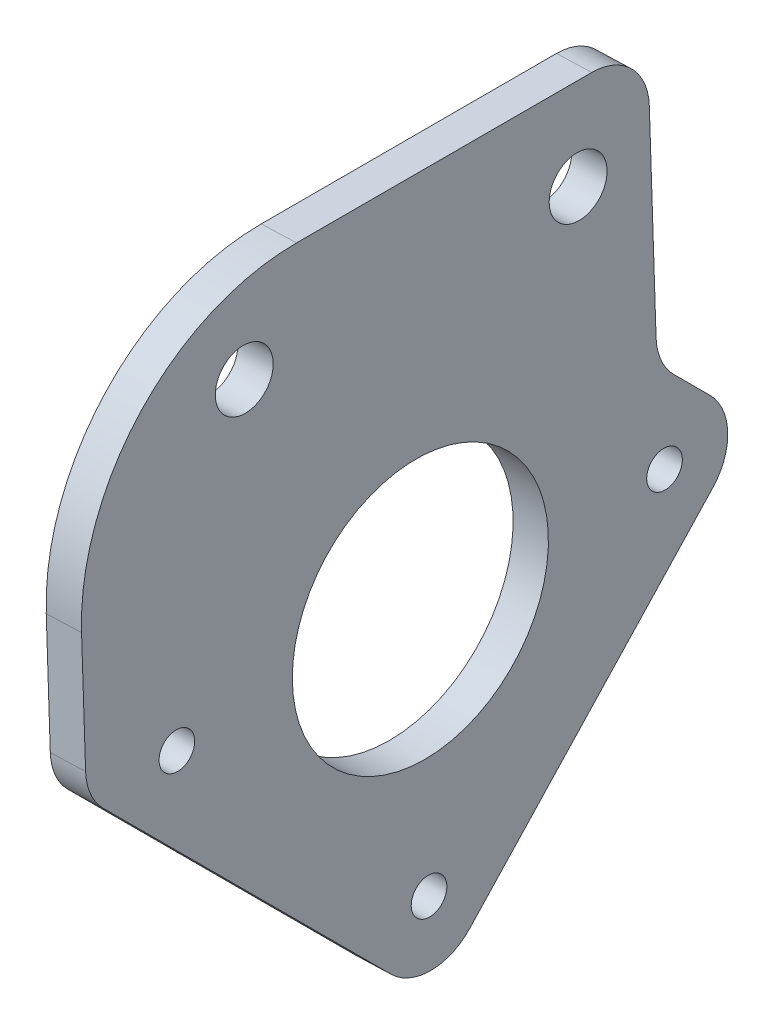
ISO-10303-21;
HEADER;
FILE_DESCRIPTION(('STEP AP214'),'2;1');
FILE_NAME('part.step','',(''),(''),'','','');
FILE_SCHEMA(('AUTOMOTIVE_DESIGN { 1 0 10303 214 1 1 1 1 }'));
ENDSEC;
DATA;
#1=APPLICATION_CONTEXT('core data for automotive mechanical design processes');
#2=APPLICATION_PROTOCOL_DEFINITION('international standard','automotive_design',2000,#1);
#3=PRODUCT_CONTEXT('',#1,'mechanical');
#4=PRODUCT('Part','Part','',(#3));
#5=PRODUCT_RELATED_PRODUCT_CATEGORY('part','',(#4));
#6=PRODUCT_DEFINITION_FORMATION('','',#4);
#7=PRODUCT_DEFINITION_CONTEXT('part definition',#1,'design');
#8=PRODUCT_DEFINITION('design','',#6,#7);
#9=PRODUCT_DEFINITION_SHAPE('','',#8);
#10=(LENGTH_UNIT() NAMED_UNIT(*) SI_UNIT(.MILLI.,.METRE.));
#11=(NAMED_UNIT(*) PLANE_ANGLE_UNIT() SI_UNIT($,.RADIAN.));
#12=(NAMED_UNIT(*) SI_UNIT($,.STERADIAN.) SOLID_ANGLE_UNIT());
#13=UNCERTAINTY_MEASURE_WITH_UNIT(LENGTH_MEASURE(1.E-05),#10,'distance_accuracy_value','');
#14=(GEOMETRIC_REPRESENTATION_CONTEXT(3) GLOBAL_UNCERTAINTY_ASSIGNED_CONTEXT((#13)) GLOBAL_UNIT_ASSIGNED_CONTEXT((#10,
#11,#12)) REPRESENTATION_CONTEXT('',''));
#15=CARTESIAN_POINT('',(0.,0.,0.));
#16=DIRECTION('',(0.,0.,1.));
#17=DIRECTION('',(1.,0.,0.));
#18=AXIS2_PLACEMENT_3D('',#15,#16,#17);
#19=CARTESIAN_POINT('',(160.415866911299,47.665317477209,394.926215189379));
#20=DIRECTION('',(-0.999416070329976,-0.0341689678830016,0.));
#21=DIRECTION('',(0.0341689678830016,-0.999416070329976,0.));
#22=AXIS2_PLACEMENT_3D('',#19,#20,#21);
#23=CYLINDRICAL_SURFACE('',#22,20.);
#24=CARTESIAN_POINT('',(157.242720888001,47.5568310041805,394.926215189379));
#25=DIRECTION('',(-0.999416070329975,-0.0341689678830016,0.));
#26=DIRECTION('',(0.0341689678830016,-0.999416070329975,0.));
#27=AXIS2_PLACEMENT_3D('',#24,#25,#26);
#28=CIRCLE('',#27,20.);
#29=CARTESIAN_POINT('',(157.242720888001,47.5568310041805,414.926215189379));
#30=VERTEX_POINT('',#29);
#31=CARTESIAN_POINT('',(156.559341530341,67.5451524107799,394.926215189379));
#32=VERTEX_POINT('',#31);
#33=EDGE_CURVE('E158',#30,#32,#28,.T.);
#34=ORIENTED_EDGE('',*,*,#33,.F.);
#35=DIRECTION('',(-0.999416070329976,-0.0341689678830016,0.));
#36=VECTOR('',#35,1.);
#37=CARTESIAN_POINT('',(160.415866911299,47.665317477209,414.926215189379));
#38=LINE('',#37,#36);
#39=CARTESIAN_POINT('',(160.415866911299,47.665317477209,414.926215189379));
#40=VERTEX_POINT('',#39);
#41=EDGE_CURVE('E11',#40,#30,#38,.T.);
#42=ORIENTED_EDGE('',*,*,#41,.F.);
#43=CARTESIAN_POINT('',(160.415866911299,47.665317477209,394.926215189379));
#44=DIRECTION('',(-0.999416070329975,-0.0341689678830016,0.));
#45=DIRECTION('',(0.0341689678830016,-0.999416070329975,0.));
#46=AXIS2_PLACEMENT_3D('',#43,#44,#45);
#47=CIRCLE('',#46,20.);
#48=CARTESIAN_POINT('',(159.732487553638,67.6536388838084,394.926215189379));
#49=VERTEX_POINT('',#48);
#50=EDGE_CURVE('E191',#40,#49,#47,.T.);
#51=ORIENTED_EDGE('',*,*,#50,.T.);
#52=DIRECTION('',(-0.999416070329976,-0.0341689678830016,0.));
#53=VECTOR('',#52,1.);
#54=CARTESIAN_POINT('',(159.732487553638,67.6536388838084,394.926215189379));
#55=LINE('',#54,#53);
#56=EDGE_CURVE('E104',#49,#32,#55,.T.);
#57=ORIENTED_EDGE('',*,*,#56,.T.);
#58=EDGE_LOOP('',(#34,#42,#51,#57));
#59=FACE_BOUND('',#58,.T.);
#60=ADVANCED_FACE('F36',(#59),#23,.T.);
#61=CARTESIAN_POINT('',(160.779025283161,37.0432139897202,414.926215189379));
#62=DIRECTION('',(0.,0.,1.));
#63=DIRECTION('',(0.,-1.,0.));
#64=AXIS2_PLACEMENT_3D('',#61,#62,#63);
#65=PLANE('',#64);
#66=DIRECTION('',(-0.0341689678830024,0.999416070329975,0.));
#67=VECTOR('',#66,1.);
#68=CARTESIAN_POINT('',(157.605879259863,36.9347275166917,414.926215189379));
#69=LINE('',#68,#67);
#70=CARTESIAN_POINT('',(157.605879259863,36.9347275166917,414.926215189379));
#71=VERTEX_POINT('',#70);
#72=EDGE_CURVE('E189',#71,#30,#69,.T.);
#73=ORIENTED_EDGE('',*,*,#72,.F.);
#74=DIRECTION('',(-0.999416070329976,-0.0341689678830016,0.));
#75=VECTOR('',#74,1.);
#76=CARTESIAN_POINT('',(160.779025283161,37.0432139897202,414.926215189379));
#77=LINE('',#76,#75);
#78=CARTESIAN_POINT('',(160.779025283161,37.0432139897202,414.926215189379));
#79=VERTEX_POINT('',#78);
#80=EDGE_CURVE('E45',#79,#71,#77,.T.);
#81=ORIENTED_EDGE('',*,*,#80,.F.);
#82=DIRECTION('',(-0.0341689678830024,0.999416070329975,0.));
#83=VECTOR('',#82,1.);
#84=CARTESIAN_POINT('',(160.779025283161,37.0432139897202,414.926215189379));
#85=LINE('',#84,#83);
#86=EDGE_CURVE('E148',#79,#40,#85,.T.);
#87=ORIENTED_EDGE('',*,*,#86,.T.);
#88=ORIENTED_EDGE('',*,*,#41,.T.);
#89=EDGE_LOOP('',(#73,#81,#87,#88));
#90=FACE_BOUND('',#89,.T.);
#91=ADVANCED_FACE('F274',(#90),#65,.T.);
#92=CARTESIAN_POINT('',(160.779025283161,37.0432139897202,409.926215189379));
#93=DIRECTION('',(-0.999416070329976,-0.0341689678830016,0.));
#94=DIRECTION('',(0.0341689678830016,-0.999416070329976,0.));
#95=AXIS2_PLACEMENT_3D('',#92,#93,#94);
#96=CYLINDRICAL_SURFACE('',#95,4.99999999999972);
#97=CARTESIAN_POINT('',(157.605879259863,36.9347275166916,409.926215189379));
#98=DIRECTION('',(-0.999416070329975,-0.0341689678830016,0.));
#99=DIRECTION('',(0.0341689678830016,-0.999416070329975,0.));
#100=AXIS2_PLACEMENT_3D('',#97,#98,#99);
#101=CIRCLE('',#100,4.99999999999972);
#102=CARTESIAN_POINT('',(157.726684804345,33.4012581139062,413.461749095311));
#103=VERTEX_POINT('',#102);
#104=EDGE_CURVE('E135',#103,#71,#101,.T.);
#105=ORIENTED_EDGE('',*,*,#104,.F.);
#106=DIRECTION('',(-0.999416070329976,-0.0341689678830016,0.));
#107=VECTOR('',#106,1.);
#108=CARTESIAN_POINT('',(160.899830827642,33.5097445869348,413.461749095311));
#109=LINE('',#108,#107);
#110=CARTESIAN_POINT('',(160.899830827642,33.5097445869348,413.461749095311));
#111=VERTEX_POINT('',#110);
#112=EDGE_CURVE('E130',#111,#103,#109,.T.);
#113=ORIENTED_EDGE('',*,*,#112,.F.);
#114=CARTESIAN_POINT('',(160.779025283161,37.0432139897202,409.926215189379));
#115=DIRECTION('',(-0.999416070329975,-0.0341689678830016,0.));
#116=DIRECTION('',(0.0341689678830016,-0.999416070329975,0.));
#117=AXIS2_PLACEMENT_3D('',#114,#115,#116);
#118=CIRCLE('',#117,4.99999999999972);
#119=EDGE_CURVE('E133',#111,#79,#118,.T.);
#120=ORIENTED_EDGE('',*,*,#119,.T.);
#121=ORIENTED_EDGE('',*,*,#80,.T.);
#122=EDGE_LOOP('',(#105,#113,#120,#121));
#123=FACE_BOUND('',#122,.T.);
#124=ADVANCED_FACE('F132',(#123),#96,.T.);
#125=CARTESIAN_POINT('',(161.753717376477,8.53421878038838,388.471630817245));
#126=DIRECTION('',(0.0241611088962145,-0.706693880557129,0.707106781186556));
#127=DIRECTION('',(0.,-0.707313261630569,-0.706900240431085));
#128=AXIS2_PLACEMENT_3D('',#125,#126,#127);
#129=PLANE('',#128);
#130=DIRECTION('',(-0.0241611088962171,0.706693880557145,0.70710678118654));
#131=VECTOR('',#130,1.);
#132=CARTESIAN_POINT('',(158.58057135318,8.42573230735986,388.471630817245));
#133=LINE('',#132,#131);
#134=CARTESIAN_POINT('',(158.58057135318,8.42573230735964,388.471630817246));
#135=VERTEX_POINT('',#134);
#136=EDGE_CURVE('E186',#135,#103,#133,.T.);
#137=ORIENTED_EDGE('',*,*,#136,.F.);
#138=DIRECTION('',(-0.999416070329976,-0.0341689678830016,0.));
#139=VECTOR('',#138,1.);
#140=CARTESIAN_POINT('',(161.753717376477,8.53421878038816,388.471630817246));
#141=LINE('',#140,#139);
#142=CARTESIAN_POINT('',(161.753717376477,8.53421878038816,388.471630817246));
#143=VERTEX_POINT('',#142);
#144=EDGE_CURVE('E140',#143,#135,#141,.T.);
#145=ORIENTED_EDGE('',*,*,#144,.F.);
#146=DIRECTION('',(-0.0241611088962171,0.706693880557145,0.70710678118654));
#147=VECTOR('',#146,1.);
#148=CARTESIAN_POINT('',(161.753717376477,8.53421878038838,388.471630817245));
#149=LINE('',#148,#147);
#150=EDGE_CURVE('E146',#143,#111,#149,.T.);
#151=ORIENTED_EDGE('',*,*,#150,.T.);
#152=ORIENTED_EDGE('',*,*,#112,.T.);
#153=EDGE_LOOP('',(#137,#145,#151,#152));
#154=FACE_BOUND('',#153,.T.);
#155=ADVANCED_FACE('F150',(#154),#129,.T.);
#156=CARTESIAN_POINT('',(161.632911831996,12.067688183174,384.936096911313));
#157=DIRECTION('',(-0.999416070329976,-0.0341689678830016,0.));
#158=DIRECTION('',(0.0341689678830016,-0.999416070329976,0.));
#159=AXIS2_PLACEMENT_3D('',#156,#157,#158);
#160=CYLINDRICAL_SURFACE('',#159,5.00000000000003);
#161=CARTESIAN_POINT('',(158.459765808699,11.9592017101455,384.936096911313));
#162=DIRECTION('',(-0.999416070329975,-0.0341689678830016,0.));
#163=DIRECTION('',(0.0341689678830016,-0.999416070329975,0.));
#164=AXIS2_PLACEMENT_3D('',#161,#162,#163);
#165=CIRCLE('',#164,5.00000000000003);
#166=CARTESIAN_POINT('',(158.58057135318,8.42573230735959,381.40056300538));
#167=VERTEX_POINT('',#166);
#168=EDGE_CURVE('E183',#167,#135,#165,.T.);
#169=ORIENTED_EDGE('',*,*,#168,.F.);
#170=DIRECTION('',(-0.999416070329976,-0.0341689678830016,0.));
#171=VECTOR('',#170,1.);
#172=CARTESIAN_POINT('',(161.753717376477,8.53421878038811,381.40056300538));
#173=LINE('',#172,#171);
#174=CARTESIAN_POINT('',(161.753717376477,8.53421878038811,381.40056300538));
#175=VERTEX_POINT('',#174);
#176=EDGE_CURVE('E195',#175,#167,#173,.T.);
#177=ORIENTED_EDGE('',*,*,#176,.F.);
#178=CARTESIAN_POINT('',(161.632911831996,12.067688183174,384.936096911313));
#179=DIRECTION('',(-0.999416070329975,-0.0341689678830016,0.));
#180=DIRECTION('',(0.0341689678830016,-0.999416070329975,0.));
#181=AXIS2_PLACEMENT_3D('',#178,#179,#180);
#182=CIRCLE('',#181,5.00000000000003);
#183=EDGE_CURVE('E151',#175,#143,#182,.T.);
#184=ORIENTED_EDGE('',*,*,#183,.T.);
#185=ORIENTED_EDGE('',*,*,#144,.T.);
#186=EDGE_LOOP('',(#169,#177,#184,#185));
#187=FACE_BOUND('',#186,.T.);
#188=ADVANCED_FACE('F287',(#187),#160,.T.);
#189=CARTESIAN_POINT('',(160.980561891799,31.1484229582166,358.77314600741));
#190=DIRECTION('',(0.0241611088962168,-0.706693880557139,-0.707106781186546));
#191=DIRECTION('',(0.,0.707313261630559,-0.706900240431095));
#192=AXIS2_PLACEMENT_3D('',#189,#190,#191);
#193=PLANE('',#192);
#194=DIRECTION('',(0.0241611088962147,-0.706693880557135,0.707106781186549));
#195=VECTOR('',#194,1.);
#196=CARTESIAN_POINT('',(157.807415868501,31.0399364851881,358.77314600741));
#197=LINE('',#196,#195);
#198=CARTESIAN_POINT('',(157.807415868501,31.0399364851882,358.77314600741));
#199=VERTEX_POINT('',#198);
#200=EDGE_CURVE('E180',#199,#167,#197,.T.);
#201=ORIENTED_EDGE('',*,*,#200,.F.);
#202=DIRECTION('',(-0.999416070329976,-0.0341689678830016,0.));
#203=VECTOR('',#202,1.);
#204=CARTESIAN_POINT('',(160.980561891799,31.1484229582167,358.77314600741));
#205=LINE('',#204,#203);
#206=CARTESIAN_POINT('',(160.980561891799,31.1484229582167,358.77314600741));
#207=VERTEX_POINT('',#206);
#208=EDGE_CURVE('E197',#207,#199,#205,.T.);
#209=ORIENTED_EDGE('',*,*,#208,.F.);
#210=DIRECTION('',(0.0241611088962147,-0.706693880557135,0.707106781186549));
#211=VECTOR('',#210,1.);
#212=CARTESIAN_POINT('',(160.980561891799,31.1484229582166,358.77314600741));
#213=LINE('',#212,#211);
#214=EDGE_CURVE('E153',#207,#175,#213,.T.);
#215=ORIENTED_EDGE('',*,*,#214,.T.);
#216=ORIENTED_EDGE('',*,*,#176,.T.);
#217=EDGE_LOOP('',(#201,#209,#215,#216));
#218=FACE_BOUND('',#217,.T.);
#219=ADVANCED_FACE('F249',(#218),#193,.T.);
#220=CARTESIAN_POINT('',(160.859756347318,34.6818923610023,362.308679913343));
#221=DIRECTION('',(-0.999416070329976,-0.0341689678830016,0.));
#222=DIRECTION('',(0.0341689678830016,-0.999416070329976,0.));
#223=AXIS2_PLACEMENT_3D('',#220,#221,#222);
#224=CYLINDRICAL_SURFACE('',#223,4.99999999999991);
#225=CARTESIAN_POINT('',(157.68661032402,34.5734058879738,362.308679913343));
#226=DIRECTION('',(-0.999416070329975,-0.0341689678830016,0.));
#227=DIRECTION('',(0.0341689678830016,-0.999416070329975,0.));
#228=AXIS2_PLACEMENT_3D('',#225,#226,#227);
#229=CIRCLE('',#228,4.99999999999991);
#230=CARTESIAN_POINT('',(157.565804779539,38.1068752907592,358.77314600741));
#231=VERTEX_POINT('',#230);
#232=EDGE_CURVE('E177',#231,#199,#229,.T.);
#233=ORIENTED_EDGE('',*,*,#232,.F.);
#234=DIRECTION('',(-0.999416070329976,-0.0341689678830016,0.));
#235=VECTOR('',#234,1.);
#236=CARTESIAN_POINT('',(160.738950802836,38.2153617637877,358.77314600741));
#237=LINE('',#236,#235);
#238=CARTESIAN_POINT('',(160.738950802836,38.2153617637877,358.77314600741));
#239=VERTEX_POINT('',#238);
#240=EDGE_CURVE('E199',#239,#231,#237,.T.);
#241=ORIENTED_EDGE('',*,*,#240,.F.);
#242=CARTESIAN_POINT('',(160.859756347318,34.6818923610023,362.308679913343));
#243=DIRECTION('',(-0.999416070329975,-0.0341689678830016,0.));
#244=DIRECTION('',(0.0341689678830016,-0.999416070329975,0.));
#245=AXIS2_PLACEMENT_3D('',#242,#243,#244);
#246=CIRCLE('',#245,4.99999999999991);
#247=EDGE_CURVE('E243',#239,#207,#246,.T.);
#248=ORIENTED_EDGE('',*,*,#247,.T.);
#249=ORIENTED_EDGE('',*,*,#208,.T.);
#250=EDGE_LOOP('',(#233,#241,#248,#249));
#251=FACE_BOUND('',#250,.T.);
#252=ADVANCED_FACE('F255',(#251),#224,.T.);
#253=CARTESIAN_POINT('',(160.630944758408,41.3744556194703,361.934085629524));
#254=DIRECTION('',(-0.0241611088962154,0.706693880557155,-0.70710678118653));
#255=DIRECTION('',(0.,0.707313261630543,0.706900240431111));
#256=AXIS2_PLACEMENT_3D('',#253,#254,#255);
#257=PLANE('',#256);
#258=DIRECTION('',(0.024161108896216,-0.706693880557119,-0.707106781186566));
#259=VECTOR('',#258,1.);
#260=CARTESIAN_POINT('',(157.457798735111,41.2659691464418,361.934085629524));
#261=LINE('',#260,#259);
#262=CARTESIAN_POINT('',(157.457798735111,41.2659691464418,361.934085629524));
#263=VERTEX_POINT('',#262);
#264=EDGE_CURVE('E174',#263,#231,#261,.T.);
#265=ORIENTED_EDGE('',*,*,#264,.F.);
#266=DIRECTION('',(-0.999416070329976,-0.0341689678830016,0.));
#267=VECTOR('',#266,1.);
#268=CARTESIAN_POINT('',(160.630944758408,41.3744556194703,361.934085629524));
#269=LINE('',#268,#267);
#270=CARTESIAN_POINT('',(160.630944758408,41.3744556194703,361.934085629524));
#271=VERTEX_POINT('',#270);
#272=EDGE_CURVE('E201',#271,#263,#269,.T.);
#273=ORIENTED_EDGE('',*,*,#272,.F.);
#274=DIRECTION('',(0.024161108896216,-0.706693880557119,-0.707106781186566));
#275=VECTOR('',#274,1.);
#276=CARTESIAN_POINT('',(160.630944758408,41.3744556194703,361.934085629524));
#277=LINE('',#276,#275);
#278=EDGE_CURVE('E240',#271,#239,#277,.T.);
#279=ORIENTED_EDGE('',*,*,#278,.T.);
#280=ORIENTED_EDGE('',*,*,#240,.T.);
#281=EDGE_LOOP('',(#265,#273,#279,#280));
#282=FACE_BOUND('',#281,.T.);
#283=ADVANCED_FACE('F258',(#282),#257,.T.);
#284=CARTESIAN_POINT('',(160.510139213927,44.9079250222561,358.398551723591));
#285=DIRECTION('',(-0.999416070329976,-0.0341689678830016,0.));
#286=DIRECTION('',(0.0341689678830016,-0.999416070329976,0.));
#287=AXIS2_PLACEMENT_3D('',#284,#285,#286);
#288=CYLINDRICAL_SURFACE('',#287,4.99999999999996);
#289=CARTESIAN_POINT('',(157.33699319063,44.7994385492276,358.398551723591));
#290=DIRECTION('',(0.999416070329975,0.0341689678830016,0.));
#291=DIRECTION('',(-0.0341689678830016,0.999416070329975,0.));
#292=AXIS2_PLACEMENT_3D('',#289,#290,#291);
#293=CIRCLE('',#292,4.99999999999996);
#294=CARTESIAN_POINT('',(157.33699319063,44.7994385492276,363.398551723591));
#295=VERTEX_POINT('',#294);
#296=EDGE_CURVE('E171',#295,#263,#293,.T.);
#297=ORIENTED_EDGE('',*,*,#296,.F.);
#298=DIRECTION('',(-0.999416070329976,-0.0341689678830016,0.));
#299=VECTOR('',#298,1.);
#300=CARTESIAN_POINT('',(160.510139213927,44.9079250222561,363.398551723591));
#301=LINE('',#300,#299);
#302=CARTESIAN_POINT('',(160.510139213927,44.9079250222561,363.398551723591));
#303=VERTEX_POINT('',#302);
#304=EDGE_CURVE('E203',#303,#295,#301,.T.);
#305=ORIENTED_EDGE('',*,*,#304,.F.);
#306=CARTESIAN_POINT('',(160.510139213927,44.9079250222561,358.398551723591));
#307=DIRECTION('',(0.999416070329975,0.0341689678830016,0.));
#308=DIRECTION('',(-0.0341689678830016,0.999416070329975,0.));
#309=AXIS2_PLACEMENT_3D('',#306,#307,#308);
#310=CIRCLE('',#309,4.99999999999996);
#311=EDGE_CURVE('E237',#303,#271,#310,.T.);
#312=ORIENTED_EDGE('',*,*,#311,.T.);
#313=ORIENTED_EDGE('',*,*,#272,.T.);
#314=EDGE_LOOP('',(#297,#305,#312,#313));
#315=FACE_BOUND('',#314,.T.);
#316=ADVANCED_FACE('F263',(#315),#288,.F.);
#317=CARTESIAN_POINT('',(159.903332393054,62.6565585321586,363.398551723591));
#318=DIRECTION('',(0.,0.,-1.));
#319=DIRECTION('',(-1.,0.,0.));
#320=AXIS2_PLACEMENT_3D('',#317,#318,#319);
#321=PLANE('',#320);
#322=DIRECTION('',(0.0341689678830007,-0.999416070329976,0.));
#323=VECTOR('',#322,1.);
#324=CARTESIAN_POINT('',(156.730186369756,62.5480720591301,363.398551723591));
#325=LINE('',#324,#323);
#326=CARTESIAN_POINT('',(156.730186369756,62.5480720591301,363.398551723591));
#327=VERTEX_POINT('',#326);
#328=EDGE_CURVE('E168',#327,#295,#325,.T.);
#329=ORIENTED_EDGE('',*,*,#328,.F.);
#330=DIRECTION('',(-0.999416070329976,-0.0341689678830016,0.));
#331=VECTOR('',#330,1.);
#332=CARTESIAN_POINT('',(159.903332393054,62.6565585321586,363.398551723591));
#333=LINE('',#332,#331);
#334=CARTESIAN_POINT('',(159.903332393054,62.6565585321586,363.398551723591));
#335=VERTEX_POINT('',#334);
#336=EDGE_CURVE('E205',#335,#327,#333,.T.);
#337=ORIENTED_EDGE('',*,*,#336,.F.);
#338=DIRECTION('',(0.0341689678830007,-0.999416070329976,0.));
#339=VECTOR('',#338,1.);
#340=CARTESIAN_POINT('',(159.903332393054,62.6565585321586,363.398551723591));
#341=LINE('',#340,#339);
#342=EDGE_CURVE('E234',#335,#303,#341,.T.);
#343=ORIENTED_EDGE('',*,*,#342,.T.);
#344=ORIENTED_EDGE('',*,*,#304,.T.);
#345=EDGE_LOOP('',(#329,#337,#343,#344));
#346=FACE_BOUND('',#345,.T.);
#347=ADVANCED_FACE('F266',(#346),#321,.T.);
#348=CARTESIAN_POINT('',(159.903332393054,62.6565585321586,368.398551723591));
#349=DIRECTION('',(-0.999416070329976,-0.0341689678830016,0.));
#350=DIRECTION('',(0.0341689678830016,-0.999416070329976,0.));
#351=AXIS2_PLACEMENT_3D('',#348,#349,#350);
#352=CYLINDRICAL_SURFACE('',#351,4.99999999999999);
#353=CARTESIAN_POINT('',(156.730186369756,62.5480720591301,368.398551723591));
#354=DIRECTION('',(-0.999416070329975,-0.0341689678830016,0.));
#355=DIRECTION('',(0.0341689678830016,-0.999416070329975,0.));
#356=AXIS2_PLACEMENT_3D('',#353,#354,#355);
#357=CIRCLE('',#356,4.99999999999999);
#358=CARTESIAN_POINT('',(156.559341530341,67.54515241078,368.398551723591));
#359=VERTEX_POINT('',#358);
#360=EDGE_CURVE('E165',#359,#327,#357,.T.);
#361=ORIENTED_EDGE('',*,*,#360,.F.);
#362=DIRECTION('',(-0.999416070329976,-0.0341689678830016,0.));
#363=VECTOR('',#362,1.);
#364=CARTESIAN_POINT('',(159.732487553639,67.6536388838085,368.398551723591));
#365=LINE('',#364,#363);
#366=CARTESIAN_POINT('',(159.732487553639,67.6536388838085,368.398551723591));
#367=VERTEX_POINT('',#366);
#368=EDGE_CURVE('E207',#367,#359,#365,.T.);
#369=ORIENTED_EDGE('',*,*,#368,.F.);
#370=CARTESIAN_POINT('',(159.903332393054,62.6565585321586,368.398551723591));
#371=DIRECTION('',(-0.999416070329975,-0.0341689678830016,0.));
#372=DIRECTION('',(0.0341689678830016,-0.999416070329975,0.));
#373=AXIS2_PLACEMENT_3D('',#370,#371,#372);
#374=CIRCLE('',#373,4.99999999999999);
#375=EDGE_CURVE('E231',#367,#335,#374,.T.);
#376=ORIENTED_EDGE('',*,*,#375,.T.);
#377=ORIENTED_EDGE('',*,*,#336,.T.);
#378=EDGE_LOOP('',(#361,#369,#376,#377));
#379=FACE_BOUND('',#378,.T.);
#380=ADVANCED_FACE('F270',(#379),#352,.T.);
#381=CARTESIAN_POINT('',(159.732487553638,67.6536388838084,394.926215189379));
#382=DIRECTION('',(-0.0341689678830016,0.999416070329976,0.));
#383=DIRECTION('',(-0.999416070329976,-0.0341689678830016,0.));
#384=AXIS2_PLACEMENT_3D('',#381,#382,#383);
#385=PLANE('',#384);
#386=DIRECTION('',(0.,0.,-1.));
#387=VECTOR('',#386,1.);
#388=CARTESIAN_POINT('',(156.559341530341,67.5451524107799,394.926215189379));
#389=LINE('',#388,#387);
#390=EDGE_CURVE('E161',#32,#359,#389,.T.);
#391=ORIENTED_EDGE('',*,*,#390,.F.);
#392=ORIENTED_EDGE('',*,*,#56,.F.);
#393=DIRECTION('',(0.,0.,-1.));
#394=VECTOR('',#393,1.);
#395=CARTESIAN_POINT('',(159.732487553638,67.6536388838084,394.926215189379));
#396=LINE('',#395,#394);
#397=EDGE_CURVE('E229',#49,#367,#396,.T.);
#398=ORIENTED_EDGE('',*,*,#397,.T.);
#399=ORIENTED_EDGE('',*,*,#368,.T.);
#400=EDGE_LOOP('',(#391,#392,#398,#399));
#401=FACE_BOUND('',#400,.T.);
#402=ADVANCED_FACE('F271',(#401),#385,.T.);
#403=CARTESIAN_POINT('',(160.415866911299,47.665317477209,394.926215189379));
#404=DIRECTION('',(-0.999416070329975,-0.0341689678830016,0.));
#405=DIRECTION('',(0.0341689678830016,-0.999416070329975,0.));
#406=AXIS2_PLACEMENT_3D('',#403,#404,#405);
#407=PLANE('',#406);
#408=CARTESIAN_POINT('',(160.861039227631,34.6443690970294,406.806051723591));
#409=DIRECTION('',(-0.999416070329975,-0.0341689678830016,0.));
#410=DIRECTION('',(0.0341689678830016,-0.999416070329975,0.));
#411=AXIS2_PLACEMENT_3D('',#408,#409,#410);
#412=CIRCLE('',#411,1.59999999999993);
#413=CARTESIAN_POINT('',(160.915709576244,33.0453033845015,406.806051723591));
#414=VERTEX_POINT('',#413);
#415=EDGE_CURVE('E343',#414,#414,#412,.T.);
#416=ORIENTED_EDGE('',*,*,#415,.T.);
#417=EDGE_LOOP('',(#416));
#418=FACE_BOUND('',#417,.T.);
#419=CARTESIAN_POINT('',(160.861039227631,34.6443690970294,362.99105172359));
#420=DIRECTION('',(-0.999416070329975,-0.0341689678830016,0.));
#421=DIRECTION('',(0.0341689678830016,-0.999416070329975,0.));
#422=AXIS2_PLACEMENT_3D('',#419,#420,#421);
#423=CIRCLE('',#422,1.59999999999993);
#424=CARTESIAN_POINT('',(160.915709576244,33.0453033845015,362.99105172359));
#425=VERTEX_POINT('',#424);
#426=EDGE_CURVE('E347',#425,#425,#423,.T.);
#427=ORIENTED_EDGE('',*,*,#426,.T.);
#428=EDGE_LOOP('',(#427));
#429=FACE_BOUND('',#428,.T.);
#430=CARTESIAN_POINT('',(161.609595891528,12.7496615362755,384.898551723591));
#431=DIRECTION('',(-0.999416070329975,-0.0341689678830016,0.));
#432=DIRECTION('',(0.0341689678830016,-0.999416070329975,0.));
#433=AXIS2_PLACEMENT_3D('',#430,#431,#432);
#434=CIRCLE('',#433,1.59999999999993);
#435=CARTESIAN_POINT('',(161.664266240141,11.1505958237476,384.898551723591));
#436=VERTEX_POINT('',#435);
#437=EDGE_CURVE('E355',#436,#436,#434,.T.);
#438=ORIENTED_EDGE('',*,*,#437,.T.);
#439=EDGE_LOOP('',(#438));
#440=FACE_BOUND('',#439,.T.);
#441=CARTESIAN_POINT('',(160.005839296703,59.6583103211687,369.898551723591));
#442=DIRECTION('',(-0.999416070329975,-0.0341689678830016,0.));
#443=DIRECTION('',(0.0341689678830016,-0.999416070329975,0.));
#444=AXIS2_PLACEMENT_3D('',#441,#442,#443);
#445=CIRCLE('',#444,2.59999999999999);
#446=CARTESIAN_POINT('',(160.094678613198,57.0598285383108,369.898551723591));
#447=VERTEX_POINT('',#446);
#448=EDGE_CURVE('E39',#447,#447,#445,.T.);
#449=ORIENTED_EDGE('',*,*,#448,.T.);
#450=EDGE_LOOP('',(#449));
#451=FACE_BOUND('',#450,.T.);
#452=CARTESIAN_POINT('',(160.005839296703,59.6583103211687,399.898551723591));
#453=DIRECTION('',(-0.999416070329975,-0.0341689678830016,0.));
#454=DIRECTION('',(0.0341689678830016,-0.999416070329975,0.));
#455=AXIS2_PLACEMENT_3D('',#452,#453,#454);
#456=CIRCLE('',#455,2.59999999999999);
#457=CARTESIAN_POINT('',(160.094678613198,57.0598285383108,399.898551723591));
#458=VERTEX_POINT('',#457);
#459=EDGE_CURVE('E209',#458,#458,#456,.T.);
#460=ORIENTED_EDGE('',*,*,#459,.T.);
#461=EDGE_LOOP('',(#460));
#462=FACE_BOUND('',#461,.T.);
#463=CARTESIAN_POINT('',(160.858855446805,34.7082430091375,384.92621518938));
#464=DIRECTION('',(-0.999416070329975,-0.0341689678830016,0.));
#465=DIRECTION('',(0.0341689678830016,-0.999416070329975,0.));
#466=AXIS2_PLACEMENT_3D('',#463,#464,#465);
#467=CIRCLE('',#466,11.5);
#468=CARTESIAN_POINT('',(161.25179857746,23.2149582003427,384.92621518938));
#469=VERTEX_POINT('',#468);
#470=EDGE_CURVE('E162',#469,#469,#467,.T.);
#471=ORIENTED_EDGE('',*,*,#470,.T.);
#472=EDGE_LOOP('',(#471));
#473=FACE_BOUND('',#472,.T.);
#474=ORIENTED_EDGE('',*,*,#50,.F.);
#475=ORIENTED_EDGE('',*,*,#86,.F.);
#476=ORIENTED_EDGE('',*,*,#119,.F.);
#477=ORIENTED_EDGE('',*,*,#150,.F.);
#478=ORIENTED_EDGE('',*,*,#183,.F.);
#479=ORIENTED_EDGE('',*,*,#214,.F.);
#480=ORIENTED_EDGE('',*,*,#247,.F.);
#481=ORIENTED_EDGE('',*,*,#278,.F.);
#482=ORIENTED_EDGE('',*,*,#311,.F.);
#483=ORIENTED_EDGE('',*,*,#342,.F.);
#484=ORIENTED_EDGE('',*,*,#375,.F.);
#485=ORIENTED_EDGE('',*,*,#397,.F.);
#486=EDGE_LOOP('',(#474,#475,#476,#477,#478,#479,#480,#481,#482,#483,#484,#485));
#487=FACE_BOUND('',#486,.T.);
#488=ADVANCED_FACE('F144',(#418,#429,#440,#451,#462,#473,#487),#407,.F.);
#489=CARTESIAN_POINT('',(157.242720888001,47.5568310041805,394.926215189379));
#490=DIRECTION('',(-0.999416070329975,-0.0341689678830016,0.));
#491=DIRECTION('',(0.0341689678830016,-0.999416070329975,0.));
#492=AXIS2_PLACEMENT_3D('',#489,#490,#491);
#493=PLANE('',#492);
#494=CARTESIAN_POINT('',(157.687893204334,34.5358826240009,406.806051723591));
#495=DIRECTION('',(-0.999416070329976,-0.0341689678830016,0.));
#496=DIRECTION('',(0.0341689678830016,-0.999416070329976,0.));
#497=AXIS2_PLACEMENT_3D('',#494,#495,#496);
#498=CIRCLE('',#497,1.59999999999994);
#499=CARTESIAN_POINT('',(157.742563552946,32.936816911473,406.806051723591));
#500=VERTEX_POINT('',#499);
#501=EDGE_CURVE('E341',#500,#500,#498,.T.);
#502=ORIENTED_EDGE('',*,*,#501,.F.);
#503=EDGE_LOOP('',(#502));
#504=FACE_BOUND('',#503,.T.);
#505=CARTESIAN_POINT('',(157.687893204334,34.5358826240009,362.99105172359));
#506=DIRECTION('',(-0.999416070329976,-0.0341689678830016,0.));
#507=DIRECTION('',(0.0341689678830016,-0.999416070329976,0.));
#508=AXIS2_PLACEMENT_3D('',#505,#506,#507);
#509=CIRCLE('',#508,1.59999999999994);
#510=CARTESIAN_POINT('',(157.742563552947,32.936816911473,362.99105172359));
#511=VERTEX_POINT('',#510);
#512=EDGE_CURVE('E344',#511,#511,#509,.T.);
#513=ORIENTED_EDGE('',*,*,#512,.F.);
#514=EDGE_LOOP('',(#513));
#515=FACE_BOUND('',#514,.T.);
#516=CARTESIAN_POINT('',(158.436449868231,12.641175063247,384.898551723591));
#517=DIRECTION('',(-0.999416070329976,-0.0341689678830016,0.));
#518=DIRECTION('',(0.0341689678830016,-0.999416070329976,0.));
#519=AXIS2_PLACEMENT_3D('',#516,#517,#518);
#520=CIRCLE('',#519,1.59999999999994);
#521=CARTESIAN_POINT('',(158.491120216843,11.0421093507191,384.898551723591));
#522=VERTEX_POINT('',#521);
#523=EDGE_CURVE('E353',#522,#522,#520,.T.);
#524=ORIENTED_EDGE('',*,*,#523,.F.);
#525=EDGE_LOOP('',(#524));
#526=FACE_BOUND('',#525,.T.);
#527=CARTESIAN_POINT('',(156.832693273405,59.5498238481402,369.898551723591));
#528=DIRECTION('',(-0.999416070329976,-0.0341689678830016,0.));
#529=DIRECTION('',(0.0341689678830016,-0.999416070329976,0.));
#530=AXIS2_PLACEMENT_3D('',#527,#528,#529);
#531=CIRCLE('',#530,2.59999999999999);
#532=CARTESIAN_POINT('',(156.921532589901,56.9513420652822,369.898551723591));
#533=VERTEX_POINT('',#532);
#534=EDGE_CURVE('E222',#533,#533,#531,.T.);
#535=ORIENTED_EDGE('',*,*,#534,.F.);
#536=EDGE_LOOP('',(#535));
#537=FACE_BOUND('',#536,.T.);
#538=CARTESIAN_POINT('',(156.832693273405,59.5498238481402,399.898551723591));
#539=DIRECTION('',(-0.999416070329976,-0.0341689678830016,0.));
#540=DIRECTION('',(0.0341689678830016,-0.999416070329976,0.));
#541=AXIS2_PLACEMENT_3D('',#538,#539,#540);
#542=CIRCLE('',#541,2.59999999999999);
#543=CARTESIAN_POINT('',(156.921532589901,56.9513420652822,399.898551723591));
#544=VERTEX_POINT('',#543);
#545=EDGE_CURVE('E212',#544,#544,#542,.T.);
#546=ORIENTED_EDGE('',*,*,#545,.F.);
#547=EDGE_LOOP('',(#546));
#548=FACE_BOUND('',#547,.T.);
#549=CARTESIAN_POINT('',(157.685709423508,34.5997565361089,384.92621518938));
#550=DIRECTION('',(-0.999416070329976,-0.0341689678830016,0.));
#551=DIRECTION('',(0.0341689678830016,-0.999416070329976,0.));
#552=AXIS2_PLACEMENT_3D('',#549,#550,#551);
#553=CIRCLE('',#552,11.5);
#554=CARTESIAN_POINT('',(158.078652554162,23.1064717273142,384.92621518938));
#555=VERTEX_POINT('',#554);
#556=EDGE_CURVE('E211',#555,#555,#553,.T.);
#557=ORIENTED_EDGE('',*,*,#556,.F.);
#558=EDGE_LOOP('',(#557));
#559=FACE_BOUND('',#558,.T.);
#560=ORIENTED_EDGE('',*,*,#33,.T.);
#561=ORIENTED_EDGE('',*,*,#390,.T.);
#562=ORIENTED_EDGE('',*,*,#360,.T.);
#563=ORIENTED_EDGE('',*,*,#328,.T.);
#564=ORIENTED_EDGE('',*,*,#296,.T.);
#565=ORIENTED_EDGE('',*,*,#264,.T.);
#566=ORIENTED_EDGE('',*,*,#232,.T.);
#567=ORIENTED_EDGE('',*,*,#200,.T.);
#568=ORIENTED_EDGE('',*,*,#168,.T.);
#569=ORIENTED_EDGE('',*,*,#136,.T.);
#570=ORIENTED_EDGE('',*,*,#104,.T.);
#571=ORIENTED_EDGE('',*,*,#72,.T.);
#572=EDGE_LOOP('',(#560,#561,#562,#563,#564,#565,#566,#567,#568,#569,#570,#571));
#573=FACE_BOUND('',#572,.T.);
#574=ADVANCED_FACE('F273',(#504,#515,#526,#537,#548,#559,#573),#493,.T.);
#575=CARTESIAN_POINT('',(157.685709423508,34.5997565361089,384.92621518938));
#576=DIRECTION('',(-0.999416070329976,-0.0341689678830016,0.));
#577=DIRECTION('',(0.0341689678830016,-0.999416070329976,0.));
#578=AXIS2_PLACEMENT_3D('',#575,#576,#577);
#579=CYLINDRICAL_SURFACE('',#578,11.5);
#580=ORIENTED_EDGE('',*,*,#556,.T.);
#581=EDGE_LOOP('',(#580));
#582=FACE_BOUND('',#581,.T.);
#583=ORIENTED_EDGE('',*,*,#470,.F.);
#584=EDGE_LOOP('',(#583));
#585=FACE_BOUND('',#584,.T.);
#586=ADVANCED_FACE('F310',(#582,#585),#579,.F.);
#587=CARTESIAN_POINT('',(156.832693273405,59.5498238481402,399.898551723591));
#588=DIRECTION('',(-0.999416070329976,-0.0341689678830016,0.));
#589=DIRECTION('',(0.0341689678830016,-0.999416070329976,0.));
#590=AXIS2_PLACEMENT_3D('',#587,#588,#589);
#591=CYLINDRICAL_SURFACE('',#590,2.59999999999999);
#592=ORIENTED_EDGE('',*,*,#545,.T.);
#593=EDGE_LOOP('',(#592));
#594=FACE_BOUND('',#593,.T.);
#595=ORIENTED_EDGE('',*,*,#459,.F.);
#596=EDGE_LOOP('',(#595));
#597=FACE_BOUND('',#596,.T.);
#598=ADVANCED_FACE('F317',(#594,#597),#591,.F.);
#599=CARTESIAN_POINT('',(156.832693273405,59.5498238481402,369.898551723591));
#600=DIRECTION('',(-0.999416070329976,-0.0341689678830016,0.));
#601=DIRECTION('',(0.0341689678830016,-0.999416070329976,0.));
#602=AXIS2_PLACEMENT_3D('',#599,#600,#601);
#603=CYLINDRICAL_SURFACE('',#602,2.59999999999999);
#604=ORIENTED_EDGE('',*,*,#534,.T.);
#605=EDGE_LOOP('',(#604));
#606=FACE_BOUND('',#605,.T.);
#607=ORIENTED_EDGE('',*,*,#448,.F.);
#608=EDGE_LOOP('',(#607));
#609=FACE_BOUND('',#608,.T.);
#610=ADVANCED_FACE('F321',(#606,#609),#603,.F.);
#611=CARTESIAN_POINT('',(158.436449868231,12.641175063247,384.898551723591));
#612=DIRECTION('',(-0.999416070329976,-0.0341689678830016,0.));
#613=DIRECTION('',(0.0341689678830016,-0.999416070329976,0.));
#614=AXIS2_PLACEMENT_3D('',#611,#612,#613);
#615=CYLINDRICAL_SURFACE('',#614,1.59999999999993);
#616=ORIENTED_EDGE('',*,*,#523,.T.);
#617=EDGE_LOOP('',(#616));
#618=FACE_BOUND('',#617,.T.);
#619=ORIENTED_EDGE('',*,*,#437,.F.);
#620=EDGE_LOOP('',(#619));
#621=FACE_BOUND('',#620,.T.);
#622=ADVANCED_FACE('F324',(#618,#621),#615,.F.);
#623=CARTESIAN_POINT('',(157.687893204334,34.5358826240009,362.99105172359));
#624=DIRECTION('',(-0.999416070329976,-0.0341689678830016,0.));
#625=DIRECTION('',(0.0341689678830016,-0.999416070329976,0.));
#626=AXIS2_PLACEMENT_3D('',#623,#624,#625);
#627=CYLINDRICAL_SURFACE('',#626,1.59999999999993);
#628=ORIENTED_EDGE('',*,*,#512,.T.);
#629=EDGE_LOOP('',(#628));
#630=FACE_BOUND('',#629,.T.);
#631=ORIENTED_EDGE('',*,*,#426,.F.);
#632=EDGE_LOOP('',(#631));
#633=FACE_BOUND('',#632,.T.);
#634=ADVANCED_FACE('F328',(#630,#633),#627,.F.);
#635=CARTESIAN_POINT('',(157.687893204334,34.5358826240009,406.806051723591));
#636=DIRECTION('',(-0.999416070329976,-0.0341689678830016,0.));
#637=DIRECTION('',(0.0341689678830016,-0.999416070329976,0.));
#638=AXIS2_PLACEMENT_3D('',#635,#636,#637);
#639=CYLINDRICAL_SURFACE('',#638,1.59999999999993);
#640=ORIENTED_EDGE('',*,*,#501,.T.);
#641=EDGE_LOOP('',(#640));
#642=FACE_BOUND('',#641,.T.);
#643=ORIENTED_EDGE('',*,*,#415,.F.);
#644=EDGE_LOOP('',(#643));
#645=FACE_BOUND('',#644,.T.);
#646=ADVANCED_FACE('F332',(#642,#645),#639,.F.);
#647=CLOSED_SHELL('',(#60,#91,#124,#155,#188,#219,#252,#283,#316,#347,#380,#402,#488,#574,#586,
#598,#610,#622,#634,#646));
#648=MANIFOLD_SOLID_BREP('B2',#647);
#649=ADVANCED_BREP_SHAPE_REPRESENTATION('',(#18,#648),#14);
#650=SHAPE_DEFINITION_REPRESENTATION(#9,#649);
ENDSEC;
END-ISO-10303-21;
